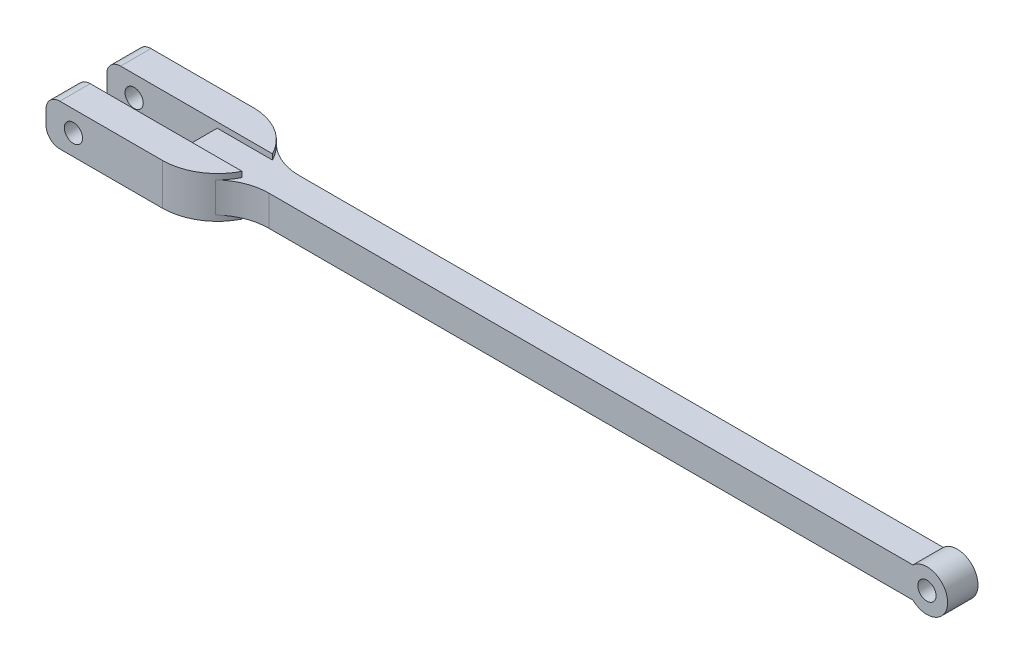
ISO-10303-21;
HEADER;
FILE_DESCRIPTION(('STEP AP214'),'2;1');
FILE_NAME('part.step','',(''),(''),'','','');
FILE_SCHEMA(('AUTOMOTIVE_DESIGN { 1 0 10303 214 1 1 1 1 }'));
ENDSEC;
DATA;
#1=APPLICATION_CONTEXT('core data for automotive mechanical design processes');
#2=APPLICATION_PROTOCOL_DEFINITION('international standard','automotive_design',2000,#1);
#3=PRODUCT_CONTEXT('',#1,'mechanical');
#4=PRODUCT('Part','Part','',(#3));
#5=PRODUCT_RELATED_PRODUCT_CATEGORY('part','',(#4));
#6=PRODUCT_DEFINITION_FORMATION('','',#4);
#7=PRODUCT_DEFINITION_CONTEXT('part definition',#1,'design');
#8=PRODUCT_DEFINITION('design','',#6,#7);
#9=PRODUCT_DEFINITION_SHAPE('','',#8);
#10=(LENGTH_UNIT() NAMED_UNIT(*) SI_UNIT(.MILLI.,.METRE.));
#11=(NAMED_UNIT(*) PLANE_ANGLE_UNIT() SI_UNIT($,.RADIAN.));
#12=(NAMED_UNIT(*) SI_UNIT($,.STERADIAN.) SOLID_ANGLE_UNIT());
#13=UNCERTAINTY_MEASURE_WITH_UNIT(LENGTH_MEASURE(1.E-05),#10,'distance_accuracy_value','');
#14=(GEOMETRIC_REPRESENTATION_CONTEXT(3) GLOBAL_UNCERTAINTY_ASSIGNED_CONTEXT((#13)) GLOBAL_UNIT_ASSIGNED_CONTEXT((#10,
#11,#12)) REPRESENTATION_CONTEXT('',''));
#15=CARTESIAN_POINT('',(0.,0.,0.));
#16=DIRECTION('',(0.,0.,1.));
#17=DIRECTION('',(1.,0.,0.));
#18=AXIS2_PLACEMENT_3D('',#15,#16,#17);
#19=CARTESIAN_POINT('',(-127.,-7.00615472610214,6.985));
#20=DIRECTION('',(0.,0.,1.));
#21=DIRECTION('',(1.,0.,0.));
#22=AXIS2_PLACEMENT_3D('',#19,#20,#21);
#23=PLANE('',#22);
#24=CARTESIAN_POINT('',(213.36,0.,6.985));
#25=DIRECTION('',(0.,0.,1.));
#26=DIRECTION('',(1.,0.,0.));
#27=AXIS2_PLACEMENT_3D('',#24,#25,#26);
#28=CIRCLE('',#27,4.191);
#29=CARTESIAN_POINT('',(217.551,0.,6.985));
#30=VERTEX_POINT('',#29);
#31=EDGE_CURVE('E1674',#30,#30,#28,.T.);
#32=ORIENTED_EDGE('',*,*,#31,.F.);
#33=EDGE_LOOP('',(#32));
#34=FACE_BOUND('',#33,.T.);
#35=DIRECTION('',(1.,0.,0.));
#36=VECTOR('',#35,1.);
#37=CARTESIAN_POINT('',(-127.,7.00615472610214,6.985));
#38=LINE('',#37,#36);
#39=CARTESIAN_POINT('',(-89.295353820586,7.00615472610214,6.985));
#40=VERTEX_POINT('',#39);
#41=CARTESIAN_POINT('',(206.907138545272,7.00615472610214,6.985));
#42=VERTEX_POINT('',#41);
#43=EDGE_CURVE('E1708',#40,#42,#38,.T.);
#44=ORIENTED_EDGE('',*,*,#43,.F.);
#45=DIRECTION('',(0.,1.,0.));
#46=VECTOR('',#45,1.);
#47=CARTESIAN_POINT('',(-89.295353820586,-7.00615472610213,6.985));
#48=LINE('',#47,#46);
#49=CARTESIAN_POINT('',(-89.295353820586,-7.00615472610214,6.985));
#50=VERTEX_POINT('',#49);
#51=EDGE_CURVE('E1732',#40,#50,#48,.F.);
#52=ORIENTED_EDGE('',*,*,#51,.T.);
#53=DIRECTION('',(1.,0.,0.));
#54=VECTOR('',#53,1.);
#55=CARTESIAN_POINT('',(-127.,-7.00615472610214,6.985));
#56=LINE('',#55,#54);
#57=CARTESIAN_POINT('',(206.907138545272,-7.00615472610214,6.985));
#58=VERTEX_POINT('',#57);
#59=EDGE_CURVE('E1702',#50,#58,#56,.T.);
#60=ORIENTED_EDGE('',*,*,#59,.T.);
#61=CARTESIAN_POINT('',(213.36,0.,6.985));
#62=DIRECTION('',(0.,0.,1.));
#63=DIRECTION('',(1.,0.,0.));
#64=AXIS2_PLACEMENT_3D('',#61,#62,#63);
#65=CIRCLE('',#64,9.525);
#66=EDGE_CURVE('E1681',#58,#42,#65,.T.);
#67=ORIENTED_EDGE('',*,*,#66,.T.);
#68=EDGE_LOOP('',(#44,#52,#60,#67));
#69=FACE_BOUND('',#68,.T.);
#70=ADVANCED_FACE('F1452',(#34,#69),#23,.T.);
#71=CARTESIAN_POINT('',(-127.,7.00615472610214,-6.985));
#72=DIRECTION('',(0.,1.,0.));
#73=DIRECTION('',(0.,0.,1.));
#74=AXIS2_PLACEMENT_3D('',#71,#72,#73);
#75=PLANE('',#74);
#76=CARTESIAN_POINT('',(-127.,7.00615472610214,6.985));
#77=VERTEX_POINT('',#76);
#78=CARTESIAN_POINT('',(-101.6,7.00615472610214,6.985));
#79=VERTEX_POINT('',#78);
#80=EDGE_CURVE('E1705',#77,#79,#38,.T.);
#81=ORIENTED_EDGE('',*,*,#80,.T.);
#82=CARTESIAN_POINT('',(-124.285401687268,7.00615472610214,-4.4490211063963));
#83=DIRECTION('',(0.,1.,0.));
#84=DIRECTION('',(0.,0.,1.));
#85=AXIS2_PLACEMENT_3D('',#82,#83,#84);
#86=CIRCLE('',#85,25.4040211063963);
#87=CARTESIAN_POINT('',(-106.788993033759,7.00615472610214,13.9694471416324));
#88=VERTEX_POINT('',#87);
#89=EDGE_CURVE('E1740',#88,#79,#86,.T.);
#90=ORIENTED_EDGE('',*,*,#89,.F.);
#91=CARTESIAN_POINT('',(-89.295353820586,7.00615472610214,32.385));
#92=DIRECTION('',(0.,1.,0.));
#93=DIRECTION('',(0.,0.,1.));
#94=AXIS2_PLACEMENT_3D('',#91,#92,#93);
#95=CIRCLE('',#94,25.4);
#96=EDGE_CURVE('E1750',#88,#40,#95,.F.);
#97=ORIENTED_EDGE('',*,*,#96,.T.);
#98=ORIENTED_EDGE('',*,*,#43,.T.);
#99=DIRECTION('',(0.,0.,-1.));
#100=VECTOR('',#99,1.);
#101=CARTESIAN_POINT('',(206.907138545272,7.00615472610214,33.9257683632075));
#102=LINE('',#101,#100);
#103=CARTESIAN_POINT('',(206.907138545272,7.00615472610214,-6.985));
#104=VERTEX_POINT('',#103);
#105=EDGE_CURVE('E1689',#42,#104,#102,.T.);
#106=ORIENTED_EDGE('',*,*,#105,.T.);
#107=DIRECTION('',(1.,0.,0.));
#108=VECTOR('',#107,1.);
#109=CARTESIAN_POINT('',(-127.,7.00615472610214,-6.985));
#110=LINE('',#109,#108);
#111=CARTESIAN_POINT('',(-89.295353820586,7.00615472610214,-6.985));
#112=VERTEX_POINT('',#111);
#113=EDGE_CURVE('E1706',#112,#104,#110,.T.);
#114=ORIENTED_EDGE('',*,*,#113,.F.);
#115=CARTESIAN_POINT('',(-89.295353820586,7.00615472610214,-32.385));
#116=DIRECTION('',(0.,1.,0.));
#117=DIRECTION('',(0.,0.,1.));
#118=AXIS2_PLACEMENT_3D('',#115,#116,#117);
#119=CIRCLE('',#118,25.4);
#120=CARTESIAN_POINT('',(-106.788993033759,7.00615472610214,-13.9694471416324));
#121=VERTEX_POINT('',#120);
#122=EDGE_CURVE('E1735',#112,#121,#119,.F.);
#123=ORIENTED_EDGE('',*,*,#122,.T.);
#124=CARTESIAN_POINT('',(-124.285401687268,7.00615472610214,4.4490211063963));
#125=DIRECTION('',(0.,1.,0.));
#126=DIRECTION('',(0.,0.,1.));
#127=AXIS2_PLACEMENT_3D('',#124,#125,#126);
#128=CIRCLE('',#127,25.4040211063963);
#129=CARTESIAN_POINT('',(-101.6,7.00615472610214,-6.985));
#130=VERTEX_POINT('',#129);
#131=EDGE_CURVE('E1720',#130,#121,#128,.T.);
#132=ORIENTED_EDGE('',*,*,#131,.F.);
#133=CARTESIAN_POINT('',(-127.,7.00615472610214,-6.985));
#134=VERTEX_POINT('',#133);
#135=EDGE_CURVE('E1709',#134,#130,#110,.T.);
#136=ORIENTED_EDGE('',*,*,#135,.F.);
#137=DIRECTION('',(0.,0.,1.));
#138=VECTOR('',#137,1.);
#139=CARTESIAN_POINT('',(-127.,7.00615472610214,-6.985));
#140=LINE('',#139,#138);
#141=EDGE_CURVE('E1699',#134,#77,#140,.T.);
#142=ORIENTED_EDGE('',*,*,#141,.T.);
#143=EDGE_LOOP('',(#81,#90,#97,#98,#106,#114,#123,#132,#136,#142));
#144=FACE_BOUND('',#143,.T.);
#145=ADVANCED_FACE('F1808',(#144),#75,.T.);
#146=CARTESIAN_POINT('',(-127.,-7.00615472610214,-6.985));
#147=DIRECTION('',(0.,-1.,0.));
#148=DIRECTION('',(0.,0.,-1.));
#149=AXIS2_PLACEMENT_3D('',#146,#147,#148);
#150=PLANE('',#149);
#151=DIRECTION('',(1.,0.,0.));
#152=VECTOR('',#151,1.);
#153=CARTESIAN_POINT('',(-127.,-7.00615472610214,-6.985));
#154=LINE('',#153,#152);
#155=CARTESIAN_POINT('',(-127.,-7.00615472610214,-6.985));
#156=VERTEX_POINT('',#155);
#157=CARTESIAN_POINT('',(-101.6,-7.00615472610213,-6.985));
#158=VERTEX_POINT('',#157);
#159=EDGE_CURVE('E1711',#156,#158,#154,.T.);
#160=ORIENTED_EDGE('',*,*,#159,.T.);
#161=CARTESIAN_POINT('',(-124.285401687268,-7.00615472610214,4.4490211063963));
#162=DIRECTION('',(0.,-1.,0.));
#163=DIRECTION('',(0.,0.,-1.));
#164=AXIS2_PLACEMENT_3D('',#161,#162,#163);
#165=CIRCLE('',#164,25.4040211063963);
#166=CARTESIAN_POINT('',(-106.788993033759,-7.00615472610214,-13.9694471416324));
#167=VERTEX_POINT('',#166);
#168=EDGE_CURVE('E1728',#167,#158,#165,.T.);
#169=ORIENTED_EDGE('',*,*,#168,.F.);
#170=CARTESIAN_POINT('',(-89.295353820586,-7.00615472610214,-32.385));
#171=DIRECTION('',(0.,-1.,0.));
#172=DIRECTION('',(0.,0.,-1.));
#173=AXIS2_PLACEMENT_3D('',#170,#171,#172);
#174=CIRCLE('',#173,25.4);
#175=CARTESIAN_POINT('',(-89.295353820586,-7.00615472610214,-6.985));
#176=VERTEX_POINT('',#175);
#177=EDGE_CURVE('E1727',#167,#176,#174,.F.);
#178=ORIENTED_EDGE('',*,*,#177,.T.);
#179=CARTESIAN_POINT('',(206.907138545272,-7.00615472610214,-6.985));
#180=VERTEX_POINT('',#179);
#181=EDGE_CURVE('E1713',#176,#180,#154,.T.);
#182=ORIENTED_EDGE('',*,*,#181,.T.);
#183=DIRECTION('',(0.,0.,-1.));
#184=VECTOR('',#183,1.);
#185=CARTESIAN_POINT('',(206.907138545272,-7.00615472610214,33.9257683632075));
#186=LINE('',#185,#184);
#187=EDGE_CURVE('E1703',#180,#58,#186,.F.);
#188=ORIENTED_EDGE('',*,*,#187,.T.);
#189=ORIENTED_EDGE('',*,*,#59,.F.);
#190=CARTESIAN_POINT('',(-89.295353820586,-7.00615472610214,32.385));
#191=DIRECTION('',(0.,-1.,0.));
#192=DIRECTION('',(0.,0.,-1.));
#193=AXIS2_PLACEMENT_3D('',#190,#191,#192);
#194=CIRCLE('',#193,25.4);
#195=CARTESIAN_POINT('',(-106.788993033759,-7.00615472610214,13.9694471416324));
#196=VERTEX_POINT('',#195);
#197=EDGE_CURVE('E1744',#50,#196,#194,.F.);
#198=ORIENTED_EDGE('',*,*,#197,.T.);
#199=CARTESIAN_POINT('',(-124.285401687268,-7.00615472610214,-4.4490211063963));
#200=DIRECTION('',(0.,-1.,0.));
#201=DIRECTION('',(0.,0.,-1.));
#202=AXIS2_PLACEMENT_3D('',#199,#200,#201);
#203=CIRCLE('',#202,25.4040211063963);
#204=CARTESIAN_POINT('',(-101.6,-7.00615472610214,6.985));
#205=VERTEX_POINT('',#204);
#206=EDGE_CURVE('E1745',#205,#196,#203,.T.);
#207=ORIENTED_EDGE('',*,*,#206,.F.);
#208=CARTESIAN_POINT('',(-127.,-7.00615472610214,6.985));
#209=VERTEX_POINT('',#208);
#210=EDGE_CURVE('E1715',#209,#205,#56,.T.);
#211=ORIENTED_EDGE('',*,*,#210,.F.);
#212=DIRECTION('',(0.,0.,-1.));
#213=VECTOR('',#212,1.);
#214=CARTESIAN_POINT('',(-127.,-7.00615472610214,-6.985));
#215=LINE('',#214,#213);
#216=EDGE_CURVE('E1692',#209,#156,#215,.T.);
#217=ORIENTED_EDGE('',*,*,#216,.T.);
#218=EDGE_LOOP('',(#160,#169,#178,#182,#188,#189,#198,#207,#211,#217));
#219=FACE_BOUND('',#218,.T.);
#220=ADVANCED_FACE('F1818',(#219),#150,.T.);
#221=CARTESIAN_POINT('',(-127.,-7.00615472610214,-6.985));
#222=DIRECTION('',(0.,0.,-1.));
#223=DIRECTION('',(-1.,0.,0.));
#224=AXIS2_PLACEMENT_3D('',#221,#222,#223);
#225=PLANE('',#224);
#226=ORIENTED_EDGE('',*,*,#181,.F.);
#227=DIRECTION('',(0.,-1.,0.));
#228=VECTOR('',#227,1.);
#229=CARTESIAN_POINT('',(-89.295353820586,-7.00615472610214,-6.985));
#230=LINE('',#229,#228);
#231=EDGE_CURVE('E1726',#176,#112,#230,.F.);
#232=ORIENTED_EDGE('',*,*,#231,.T.);
#233=ORIENTED_EDGE('',*,*,#113,.T.);
#234=CARTESIAN_POINT('',(213.36,0.,-6.985));
#235=DIRECTION('',(0.,0.,-1.));
#236=DIRECTION('',(-1.,0.,0.));
#237=AXIS2_PLACEMENT_3D('',#234,#235,#236);
#238=CIRCLE('',#237,9.525);
#239=EDGE_CURVE('E1682',#180,#104,#238,.F.);
#240=ORIENTED_EDGE('',*,*,#239,.F.);
#241=EDGE_LOOP('',(#226,#232,#233,#240));
#242=FACE_BOUND('',#241,.T.);
#243=CARTESIAN_POINT('',(213.36,0.,-6.985));
#244=DIRECTION('',(0.,0.,1.));
#245=DIRECTION('',(1.,0.,0.));
#246=AXIS2_PLACEMENT_3D('',#243,#244,#245);
#247=CIRCLE('',#246,4.191);
#248=CARTESIAN_POINT('',(217.551,0.,-6.985));
#249=VERTEX_POINT('',#248);
#250=EDGE_CURVE('E1677',#249,#249,#247,.T.);
#251=ORIENTED_EDGE('',*,*,#250,.T.);
#252=EDGE_LOOP('',(#251));
#253=FACE_BOUND('',#252,.T.);
#254=ADVANCED_FACE('F1937',(#242,#253),#225,.T.);
#255=CARTESIAN_POINT('',(-127.,0.,0.));
#256=DIRECTION('',(1.,0.,0.));
#257=DIRECTION('',(0.,0.,-1.));
#258=AXIS2_PLACEMENT_3D('',#255,#256,#257);
#259=PLANE('',#258);
#260=DIRECTION('',(0.,-1.,0.));
#261=VECTOR('',#260,1.);
#262=CARTESIAN_POINT('',(-127.,-7.00615472610214,6.985));
#263=LINE('',#262,#261);
#264=EDGE_CURVE('E1686',#77,#209,#263,.T.);
#265=ORIENTED_EDGE('',*,*,#264,.F.);
#266=ORIENTED_EDGE('',*,*,#141,.F.);
#267=DIRECTION('',(0.,1.,0.));
#268=VECTOR('',#267,1.);
#269=CARTESIAN_POINT('',(-127.,-7.00615472610214,-6.985));
#270=LINE('',#269,#268);
#271=EDGE_CURVE('E1695',#156,#134,#270,.T.);
#272=ORIENTED_EDGE('',*,*,#271,.F.);
#273=ORIENTED_EDGE('',*,*,#216,.F.);
#274=EDGE_LOOP('',(#265,#266,#272,#273));
#275=FACE_BOUND('',#274,.T.);
#276=ADVANCED_FACE('F1931',(#275),#259,.F.);
#277=CARTESIAN_POINT('',(213.36,0.,33.9257683632075));
#278=DIRECTION('',(0.,0.,-1.));
#279=DIRECTION('',(-1.,0.,0.));
#280=AXIS2_PLACEMENT_3D('',#277,#278,#279);
#281=CYLINDRICAL_SURFACE('',#280,9.525);
#282=ORIENTED_EDGE('',*,*,#105,.F.);
#283=ORIENTED_EDGE('',*,*,#66,.F.);
#284=ORIENTED_EDGE('',*,*,#187,.F.);
#285=ORIENTED_EDGE('',*,*,#239,.T.);
#286=EDGE_LOOP('',(#282,#283,#284,#285));
#287=FACE_BOUND('',#286,.T.);
#288=ADVANCED_FACE('F1866',(#287),#281,.T.);
#289=CARTESIAN_POINT('',(213.36,0.,-6.985));
#290=DIRECTION('',(0.,0.,1.));
#291=DIRECTION('',(1.,0.,0.));
#292=AXIS2_PLACEMENT_3D('',#289,#290,#291);
#293=CYLINDRICAL_SURFACE('',#292,4.191);
#294=CARTESIAN_POINT('',(217.551,0.,-6.985));
#295=CARTESIAN_POINT('',(217.551,0.,-6.83947916666667));
#296=CARTESIAN_POINT('',(217.551,0.,-6.69395833333334));
#297=CARTESIAN_POINT('',(217.551,0.,-6.40291666666667));
#298=CARTESIAN_POINT('',(217.551,0.,-6.25739583333334));
#299=CARTESIAN_POINT('',(217.551,0.,-5.96635416666667));
#300=CARTESIAN_POINT('',(217.551,0.,-5.82083333333333));
#301=CARTESIAN_POINT('',(217.551,0.,-5.52979166666667));
#302=CARTESIAN_POINT('',(217.551,0.,-5.38427083333334));
#303=CARTESIAN_POINT('',(217.551,0.,-5.09322916666667));
#304=CARTESIAN_POINT('',(217.551,0.,-4.94770833333334));
#305=CARTESIAN_POINT('',(217.551,0.,-4.65666666666667));
#306=CARTESIAN_POINT('',(217.551,0.,-4.51114583333333));
#307=CARTESIAN_POINT('',(217.551,0.,-4.22010416666667));
#308=CARTESIAN_POINT('',(217.551,0.,-4.07458333333334));
#309=CARTESIAN_POINT('',(217.551,0.,-3.78354166666667));
#310=CARTESIAN_POINT('',(217.551,0.,-3.63802083333334));
#311=CARTESIAN_POINT('',(217.551,0.,-3.34697916666667));
#312=CARTESIAN_POINT('',(217.551,0.,-3.20145833333333));
#313=CARTESIAN_POINT('',(217.551,0.,-2.91041666666667));
#314=CARTESIAN_POINT('',(217.551,0.,-2.76489583333333));
#315=CARTESIAN_POINT('',(217.551,0.,-2.47385416666667));
#316=CARTESIAN_POINT('',(217.551,0.,-2.32833333333333));
#317=CARTESIAN_POINT('',(217.551,0.,-2.03729166666667));
#318=CARTESIAN_POINT('',(217.551,0.,-1.89177083333333));
#319=CARTESIAN_POINT('',(217.551,0.,-1.60072916666667));
#320=CARTESIAN_POINT('',(217.551,0.,-1.45520833333333));
#321=CARTESIAN_POINT('',(217.551,0.,-1.16416666666667));
#322=CARTESIAN_POINT('',(217.551,0.,-1.01864583333333));
#323=CARTESIAN_POINT('',(217.551,0.,-0.727604166666668));
#324=CARTESIAN_POINT('',(217.551,0.,-0.582083333333335));
#325=CARTESIAN_POINT('',(217.551,0.,-0.291041666666668));
#326=CARTESIAN_POINT('',(217.551,0.,-0.145520833333334));
#327=CARTESIAN_POINT('',(217.551,0.,0.145520833333333));
#328=CARTESIAN_POINT('',(217.551,0.,0.291041666666666));
#329=CARTESIAN_POINT('',(217.551,0.,0.582083333333333));
#330=CARTESIAN_POINT('',(217.551,0.,0.727604166666666));
#331=CARTESIAN_POINT('',(217.551,0.,1.01864583333333));
#332=CARTESIAN_POINT('',(217.551,0.,1.16416666666667));
#333=CARTESIAN_POINT('',(217.551,0.,1.45520833333333));
#334=CARTESIAN_POINT('',(217.551,0.,1.60072916666667));
#335=CARTESIAN_POINT('',(217.551,0.,1.89177083333333));
#336=CARTESIAN_POINT('',(217.551,0.,2.03729166666667));
#337=CARTESIAN_POINT('',(217.551,0.,2.32833333333333));
#338=CARTESIAN_POINT('',(217.551,0.,2.47385416666667));
#339=CARTESIAN_POINT('',(217.551,0.,2.76489583333333));
#340=CARTESIAN_POINT('',(217.551,0.,2.91041666666667));
#341=CARTESIAN_POINT('',(217.551,0.,3.20145833333333));
#342=CARTESIAN_POINT('',(217.551,0.,3.34697916666667));
#343=CARTESIAN_POINT('',(217.551,0.,3.63802083333333));
#344=CARTESIAN_POINT('',(217.551,0.,3.78354166666667));
#345=CARTESIAN_POINT('',(217.551,0.,4.07458333333333));
#346=CARTESIAN_POINT('',(217.551,0.,4.22010416666667));
#347=CARTESIAN_POINT('',(217.551,0.,4.51114583333333));
#348=CARTESIAN_POINT('',(217.551,0.,4.65666666666667));
#349=CARTESIAN_POINT('',(217.551,0.,4.94770833333333));
#350=CARTESIAN_POINT('',(217.551,0.,5.09322916666667));
#351=CARTESIAN_POINT('',(217.551,0.,5.38427083333333));
#352=CARTESIAN_POINT('',(217.551,0.,5.52979166666667));
#353=CARTESIAN_POINT('',(217.551,0.,5.82083333333333));
#354=CARTESIAN_POINT('',(217.551,0.,5.96635416666667));
#355=CARTESIAN_POINT('',(217.551,0.,6.25739583333333));
#356=CARTESIAN_POINT('',(217.551,0.,6.40291666666667));
#357=CARTESIAN_POINT('',(217.551,0.,6.69395833333333));
#358=CARTESIAN_POINT('',(217.551,0.,6.83947916666667));
#359=CARTESIAN_POINT('',(217.551,0.,6.985));
#360=B_SPLINE_CURVE_WITH_KNOTS('',3,(#294,#295,#296,#297,#298,#299,#300,#301,#302,#303,#304,
#305,#306,#307,#308,#309,#310,#311,#312,#313,#314,#315,#316,#317,#318,#319,#320,#321,#322,#323,
#324,#325,#326,#327,#328,#329,#330,#331,#332,#333,#334,#335,#336,#337,#338,#339,#340,#341,#342,
#343,#344,#345,#346,#347,#348,#349,#350,#351,#352,#353,#354,#355,#356,#357,#358,#359),
.UNSPECIFIED.,.F.,.F.,(4,2,2,2,2,2,2,2,2,2,2,2,2,2,2,2,2,2,2,2,2,2,2,2,2,2,2,2,2,2,2,2,4),(0.,
0.436562499999999,0.873125,1.3096875,1.74625,2.1828125,2.619375,3.0559375,3.4925,3.9290625,
4.365625,4.8021875,5.23875,5.6753125,6.111875,6.5484375,6.985,7.4215625,7.858125,8.2946875,
8.73125,9.1678125,9.604375,10.0409375,10.4775,10.9140625,11.350625,11.7871875,12.22375,
12.6603125,13.096875,13.5334375,13.97),.UNSPECIFIED.);
#361=EDGE_CURVE('BSEAM1861',#249,#30,#360,.T.);
#362=ORIENTED_EDGE('',*,*,#250,.F.);
#363=ORIENTED_EDGE('',*,*,#31,.T.);
#364=ORIENTED_EDGE('',*,*,#361,.T.);
#365=ORIENTED_EDGE('',*,*,#361,.F.);
#366=EDGE_LOOP('',(#362,#364,#363,#365));
#367=FACE_BOUND('',#366,.T.);
#368=ADVANCED_FACE('F1861',(#367),#293,.F.);
#369=CARTESIAN_POINT('',(-127.,9.525,-6.985));
#370=DIRECTION('',(0.,0.,-1.));
#371=DIRECTION('',(-1.,0.,0.));
#372=AXIS2_PLACEMENT_3D('',#369,#370,#371);
#373=PLANE('',#372);
#374=CARTESIAN_POINT('',(-165.198377534268,0.,-6.985));
#375=DIRECTION('',(0.,0.,-1.));
#376=DIRECTION('',(-1.,0.,0.));
#377=AXIS2_PLACEMENT_3D('',#374,#375,#376);
#378=CIRCLE('',#377,4.191);
#379=CARTESIAN_POINT('',(-169.389377534268,0.,-6.985));
#380=VERTEX_POINT('',#379);
#381=EDGE_CURVE('E1635',#380,#380,#378,.T.);
#382=ORIENTED_EDGE('',*,*,#381,.T.);
#383=EDGE_LOOP('',(#382));
#384=FACE_BOUND('',#383,.T.);
#385=DIRECTION('',(0.,-1.,0.));
#386=VECTOR('',#385,1.);
#387=CARTESIAN_POINT('',(-177.8,9.525,-6.98499999999999));
#388=LINE('',#387,#386);
#389=CARTESIAN_POINT('',(-177.8,3.175,-6.98499999999999));
#390=VERTEX_POINT('',#389);
#391=CARTESIAN_POINT('',(-177.8,-3.175,-6.98499999999999));
#392=VERTEX_POINT('',#391);
#393=EDGE_CURVE('E1661',#390,#392,#388,.T.);
#394=ORIENTED_EDGE('',*,*,#393,.T.);
#395=CARTESIAN_POINT('',(-171.45,-3.175,-6.985));
#396=DIRECTION('',(0.,0.,-1.));
#397=DIRECTION('',(-1.,0.,0.));
#398=AXIS2_PLACEMENT_3D('',#395,#396,#397);
#399=CIRCLE('',#398,6.35);
#400=CARTESIAN_POINT('',(-171.45,-9.525,-6.985));
#401=VERTEX_POINT('',#400);
#402=EDGE_CURVE('E1768',#392,#401,#399,.F.);
#403=ORIENTED_EDGE('',*,*,#402,.T.);
#404=DIRECTION('',(1.,0.,0.));
#405=VECTOR('',#404,1.);
#406=CARTESIAN_POINT('',(-127.,-9.525,-6.985));
#407=LINE('',#406,#405);
#408=CARTESIAN_POINT('',(-101.6,-9.525,-6.985));
#409=VERTEX_POINT('',#408);
#410=EDGE_CURVE('E1650',#401,#409,#407,.T.);
#411=ORIENTED_EDGE('',*,*,#410,.T.);
#412=DIRECTION('',(0.,-1.,0.));
#413=VECTOR('',#412,1.);
#414=CARTESIAN_POINT('',(-101.6,9.525,-6.985));
#415=LINE('',#414,#413);
#416=EDGE_CURVE('E1671',#158,#409,#415,.T.);
#417=ORIENTED_EDGE('',*,*,#416,.F.);
#418=ORIENTED_EDGE('',*,*,#159,.F.);
#419=ORIENTED_EDGE('',*,*,#271,.T.);
#420=ORIENTED_EDGE('',*,*,#135,.T.);
#421=CARTESIAN_POINT('',(-101.6,9.525,-6.985));
#422=VERTEX_POINT('',#421);
#423=EDGE_CURVE('E1675',#422,#130,#415,.T.);
#424=ORIENTED_EDGE('',*,*,#423,.F.);
#425=DIRECTION('',(1.,0.,0.));
#426=VECTOR('',#425,1.);
#427=CARTESIAN_POINT('',(-127.,9.525,-6.985));
#428=LINE('',#427,#426);
#429=CARTESIAN_POINT('',(-171.45,9.525,-6.985));
#430=VERTEX_POINT('',#429);
#431=EDGE_CURVE('E1657',#430,#422,#428,.T.);
#432=ORIENTED_EDGE('',*,*,#431,.F.);
#433=CARTESIAN_POINT('',(-171.45,3.175,-6.98499999999999));
#434=DIRECTION('',(0.,0.,-1.));
#435=DIRECTION('',(-1.,0.,0.));
#436=AXIS2_PLACEMENT_3D('',#433,#434,#435);
#437=CIRCLE('',#436,6.35);
#438=EDGE_CURVE('E1766',#430,#390,#437,.F.);
#439=ORIENTED_EDGE('',*,*,#438,.T.);
#440=EDGE_LOOP('',(#394,#403,#411,#417,#418,#419,#420,#424,#432,#439));
#441=FACE_BOUND('',#440,.T.);
#442=ADVANCED_FACE('F1783',(#384,#441),#373,.F.);
#443=CARTESIAN_POINT('',(-124.285401687268,9.525,4.4490211063963));
#444=DIRECTION('',(0.,-1.,0.));
#445=DIRECTION('',(0.,0.,-1.));
#446=AXIS2_PLACEMENT_3D('',#443,#444,#445);
#447=CYLINDRICAL_SURFACE('',#446,25.4040211063963);
#448=DIRECTION('',(0.,-1.,0.));
#449=VECTOR('',#448,1.);
#450=CARTESIAN_POINT('',(-106.788993033759,9.525,-13.9694471416324));
#451=LINE('',#450,#449);
#452=EDGE_CURVE('E1721',#121,#167,#451,.T.);
#453=ORIENTED_EDGE('',*,*,#452,.T.);
#454=ORIENTED_EDGE('',*,*,#168,.T.);
#455=ORIENTED_EDGE('',*,*,#416,.T.);
#456=CARTESIAN_POINT('',(-124.285401687268,-9.525,4.4490211063963));
#457=DIRECTION('',(0.,1.,0.));
#458=DIRECTION('',(0.,0.,-1.));
#459=AXIS2_PLACEMENT_3D('',#456,#457,#458);
#460=CIRCLE('',#459,25.4040211063963);
#461=CARTESIAN_POINT('',(-124.285401687268,-9.525,-20.955));
#462=VERTEX_POINT('',#461);
#463=EDGE_CURVE('E1652',#409,#462,#460,.T.);
#464=ORIENTED_EDGE('',*,*,#463,.T.);
#465=DIRECTION('',(0.,-1.,0.));
#466=VECTOR('',#465,1.);
#467=CARTESIAN_POINT('',(-124.285401687268,9.525,-20.955));
#468=LINE('',#467,#466);
#469=CARTESIAN_POINT('',(-124.285401687268,9.525,-20.955));
#470=VERTEX_POINT('',#469);
#471=EDGE_CURVE('E1667',#470,#462,#468,.T.);
#472=ORIENTED_EDGE('',*,*,#471,.F.);
#473=CARTESIAN_POINT('',(-124.285401687268,9.525,4.4490211063963));
#474=DIRECTION('',(0.,1.,0.));
#475=DIRECTION('',(0.,0.,-1.));
#476=AXIS2_PLACEMENT_3D('',#473,#474,#475);
#477=CIRCLE('',#476,25.4040211063963);
#478=EDGE_CURVE('E1660',#422,#470,#477,.T.);
#479=ORIENTED_EDGE('',*,*,#478,.F.);
#480=ORIENTED_EDGE('',*,*,#423,.T.);
#481=ORIENTED_EDGE('',*,*,#131,.T.);
#482=EDGE_LOOP('',(#453,#454,#455,#464,#472,#479,#480,#481));
#483=FACE_BOUND('',#482,.T.);
#484=ADVANCED_FACE('F1787',(#483),#447,.T.);
#485=CARTESIAN_POINT('',(-177.8,9.525,-20.955));
#486=DIRECTION('',(0.,0.,1.));
#487=DIRECTION('',(1.,0.,0.));
#488=AXIS2_PLACEMENT_3D('',#485,#486,#487);
#489=PLANE('',#488);
#490=CARTESIAN_POINT('',(-165.198377534268,0.,-20.955));
#491=DIRECTION('',(0.,0.,1.));
#492=DIRECTION('',(1.,0.,0.));
#493=AXIS2_PLACEMENT_3D('',#490,#491,#492);
#494=CIRCLE('',#493,4.191);
#495=CARTESIAN_POINT('',(-161.007377534268,0.,-20.955));
#496=VERTEX_POINT('',#495);
#497=EDGE_CURVE('E1873',#496,#496,#494,.T.);
#498=ORIENTED_EDGE('',*,*,#497,.T.);
#499=EDGE_LOOP('',(#498));
#500=FACE_BOUND('',#499,.T.);
#501=DIRECTION('',(-1.,0.,0.));
#502=VECTOR('',#501,1.);
#503=CARTESIAN_POINT('',(-177.8,-9.525,-20.955));
#504=LINE('',#503,#502);
#505=CARTESIAN_POINT('',(-171.45,-9.525,-20.955));
#506=VERTEX_POINT('',#505);
#507=EDGE_CURVE('E1655',#462,#506,#504,.T.);
#508=ORIENTED_EDGE('',*,*,#507,.T.);
#509=CARTESIAN_POINT('',(-171.45,-3.175,-20.955));
#510=DIRECTION('',(0.,0.,1.));
#511=DIRECTION('',(1.,0.,0.));
#512=AXIS2_PLACEMENT_3D('',#509,#510,#511);
#513=CIRCLE('',#512,6.35);
#514=CARTESIAN_POINT('',(-177.8,-3.175,-20.955));
#515=VERTEX_POINT('',#514);
#516=EDGE_CURVE('E1775',#506,#515,#513,.F.);
#517=ORIENTED_EDGE('',*,*,#516,.T.);
#518=DIRECTION('',(0.,-1.,0.));
#519=VECTOR('',#518,1.);
#520=CARTESIAN_POINT('',(-177.8,9.525,-20.955));
#521=LINE('',#520,#519);
#522=CARTESIAN_POINT('',(-177.8,3.175,-20.955));
#523=VERTEX_POINT('',#522);
#524=EDGE_CURVE('E1666',#523,#515,#521,.T.);
#525=ORIENTED_EDGE('',*,*,#524,.F.);
#526=CARTESIAN_POINT('',(-171.45,3.175,-20.955));
#527=DIRECTION('',(0.,0.,1.));
#528=DIRECTION('',(1.,0.,0.));
#529=AXIS2_PLACEMENT_3D('',#526,#527,#528);
#530=CIRCLE('',#529,6.35);
#531=CARTESIAN_POINT('',(-171.45,9.525,-20.955));
#532=VERTEX_POINT('',#531);
#533=EDGE_CURVE('E1470',#523,#532,#530,.F.);
#534=ORIENTED_EDGE('',*,*,#533,.T.);
#535=DIRECTION('',(-1.,0.,0.));
#536=VECTOR('',#535,1.);
#537=CARTESIAN_POINT('',(-177.8,9.525,-20.955));
#538=LINE('',#537,#536);
#539=EDGE_CURVE('E1663',#470,#532,#538,.T.);
#540=ORIENTED_EDGE('',*,*,#539,.F.);
#541=ORIENTED_EDGE('',*,*,#471,.T.);
#542=EDGE_LOOP('',(#508,#517,#525,#534,#540,#541));
#543=FACE_BOUND('',#542,.T.);
#544=ADVANCED_FACE('F1795',(#500,#543),#489,.F.);
#545=CARTESIAN_POINT('',(-177.8,9.525,-6.98499999999999));
#546=DIRECTION('',(1.,0.,0.));
#547=DIRECTION('',(0.,0.,-1.));
#548=AXIS2_PLACEMENT_3D('',#545,#546,#547);
#549=PLANE('',#548);
#550=ORIENTED_EDGE('',*,*,#524,.T.);
#551=DIRECTION('',(0.,0.,1.));
#552=VECTOR('',#551,1.);
#553=CARTESIAN_POINT('',(-177.8,-3.175,-6.98499999999999));
#554=LINE('',#553,#552);
#555=EDGE_CURVE('E1765',#515,#392,#554,.T.);
#556=ORIENTED_EDGE('',*,*,#555,.T.);
#557=ORIENTED_EDGE('',*,*,#393,.F.);
#558=DIRECTION('',(0.,0.,1.));
#559=VECTOR('',#558,1.);
#560=CARTESIAN_POINT('',(-177.8,3.175,-6.98499999999999));
#561=LINE('',#560,#559);
#562=EDGE_CURVE('E1764',#390,#523,#561,.F.);
#563=ORIENTED_EDGE('',*,*,#562,.T.);
#564=EDGE_LOOP('',(#550,#556,#557,#563));
#565=FACE_BOUND('',#564,.T.);
#566=ADVANCED_FACE('F1792',(#565),#549,.F.);
#567=CARTESIAN_POINT('',(-124.285401687268,9.525,4.4490211063963));
#568=DIRECTION('',(0.,-1.,0.));
#569=DIRECTION('',(0.,0.,-1.));
#570=AXIS2_PLACEMENT_3D('',#567,#568,#569);
#571=PLANE('',#570);
#572=ORIENTED_EDGE('',*,*,#539,.T.);
#573=DIRECTION('',(0.,0.,1.));
#574=VECTOR('',#573,1.);
#575=CARTESIAN_POINT('',(-171.45,9.525,4.4490211063963));
#576=LINE('',#575,#574);
#577=EDGE_CURVE('E1460',#532,#430,#576,.T.);
#578=ORIENTED_EDGE('',*,*,#577,.T.);
#579=ORIENTED_EDGE('',*,*,#431,.T.);
#580=ORIENTED_EDGE('',*,*,#478,.T.);
#581=EDGE_LOOP('',(#572,#578,#579,#580));
#582=FACE_BOUND('',#581,.T.);
#583=ADVANCED_FACE('F1778',(#582),#571,.F.);
#584=CARTESIAN_POINT('',(-124.285401687268,-9.525,4.4490211063963));
#585=DIRECTION('',(0.,-1.,0.));
#586=DIRECTION('',(0.,0.,-1.));
#587=AXIS2_PLACEMENT_3D('',#584,#585,#586);
#588=PLANE('',#587);
#589=ORIENTED_EDGE('',*,*,#410,.F.);
#590=DIRECTION('',(0.,0.,1.));
#591=VECTOR('',#590,1.);
#592=CARTESIAN_POINT('',(-171.45,-9.525,-20.955));
#593=LINE('',#592,#591);
#594=EDGE_CURVE('E1474',#401,#506,#593,.F.);
#595=ORIENTED_EDGE('',*,*,#594,.T.);
#596=ORIENTED_EDGE('',*,*,#507,.F.);
#597=ORIENTED_EDGE('',*,*,#463,.F.);
#598=EDGE_LOOP('',(#589,#595,#596,#597));
#599=FACE_BOUND('',#598,.T.);
#600=ADVANCED_FACE('F1829',(#599),#588,.T.);
#601=CARTESIAN_POINT('',(-89.295353820586,9.525,-32.385));
#602=DIRECTION('',(0.,-1.,0.));
#603=DIRECTION('',(0.,0.,-1.));
#604=AXIS2_PLACEMENT_3D('',#601,#602,#603);
#605=CYLINDRICAL_SURFACE('',#604,25.4);
#606=ORIENTED_EDGE('',*,*,#122,.F.);
#607=ORIENTED_EDGE('',*,*,#231,.F.);
#608=ORIENTED_EDGE('',*,*,#177,.F.);
#609=ORIENTED_EDGE('',*,*,#452,.F.);
#610=EDGE_LOOP('',(#606,#607,#608,#609));
#611=FACE_BOUND('',#610,.T.);
#612=ADVANCED_FACE('F1823',(#611),#605,.F.);
#613=CARTESIAN_POINT('',(-127.,9.525,6.985));
#614=DIRECTION('',(0.,0.,-1.));
#615=DIRECTION('',(-1.,0.,0.));
#616=AXIS2_PLACEMENT_3D('',#613,#614,#615);
#617=PLANE('',#616);
#618=CARTESIAN_POINT('',(-165.198377534268,0.,6.985));
#619=DIRECTION('',(0.,0.,-1.));
#620=DIRECTION('',(-1.,0.,0.));
#621=AXIS2_PLACEMENT_3D('',#618,#619,#620);
#622=CIRCLE('',#621,4.191);
#623=CARTESIAN_POINT('',(-169.389377534268,0.,6.985));
#624=VERTEX_POINT('',#623);
#625=EDGE_CURVE('E1875',#624,#624,#622,.T.);
#626=ORIENTED_EDGE('',*,*,#625,.F.);
#627=EDGE_LOOP('',(#626));
#628=FACE_BOUND('',#627,.T.);
#629=DIRECTION('',(1.,0.,0.));
#630=VECTOR('',#629,1.);
#631=CARTESIAN_POINT('',(-127.,-9.525,6.985));
#632=LINE('',#631,#630);
#633=CARTESIAN_POINT('',(-171.45,-9.525,6.985));
#634=VERTEX_POINT('',#633);
#635=CARTESIAN_POINT('',(-101.6,-9.525,6.985));
#636=VERTEX_POINT('',#635);
#637=EDGE_CURVE('E1626',#634,#636,#632,.T.);
#638=ORIENTED_EDGE('',*,*,#637,.F.);
#639=CARTESIAN_POINT('',(-171.45,-3.175,6.98499999999999));
#640=DIRECTION('',(0.,0.,-1.));
#641=DIRECTION('',(-1.,0.,0.));
#642=AXIS2_PLACEMENT_3D('',#639,#640,#641);
#643=CIRCLE('',#642,6.35);
#644=CARTESIAN_POINT('',(-177.8,-3.175,6.98499999999999));
#645=VERTEX_POINT('',#644);
#646=EDGE_CURVE('E1752',#634,#645,#643,.T.);
#647=ORIENTED_EDGE('',*,*,#646,.T.);
#648=DIRECTION('',(0.,-1.,0.));
#649=VECTOR('',#648,1.);
#650=CARTESIAN_POINT('',(-177.8,9.525,6.98499999999999));
#651=LINE('',#650,#649);
#652=CARTESIAN_POINT('',(-177.8,3.175,6.98499999999999));
#653=VERTEX_POINT('',#652);
#654=EDGE_CURVE('E1647',#653,#645,#651,.T.);
#655=ORIENTED_EDGE('',*,*,#654,.F.);
#656=CARTESIAN_POINT('',(-171.45,3.175,6.985));
#657=DIRECTION('',(0.,0.,-1.));
#658=DIRECTION('',(-1.,0.,0.));
#659=AXIS2_PLACEMENT_3D('',#656,#657,#658);
#660=CIRCLE('',#659,6.35);
#661=CARTESIAN_POINT('',(-171.45,9.525,6.985));
#662=VERTEX_POINT('',#661);
#663=EDGE_CURVE('E1753',#653,#662,#660,.T.);
#664=ORIENTED_EDGE('',*,*,#663,.T.);
#665=DIRECTION('',(1.,0.,0.));
#666=VECTOR('',#665,1.);
#667=CARTESIAN_POINT('',(-127.,9.525,6.985));
#668=LINE('',#667,#666);
#669=CARTESIAN_POINT('',(-101.6,9.525,6.985));
#670=VERTEX_POINT('',#669);
#671=EDGE_CURVE('E1629',#662,#670,#668,.T.);
#672=ORIENTED_EDGE('',*,*,#671,.T.);
#673=DIRECTION('',(0.,-1.,0.));
#674=VECTOR('',#673,1.);
#675=CARTESIAN_POINT('',(-101.6,9.525,6.985));
#676=LINE('',#675,#674);
#677=EDGE_CURVE('E1620',#670,#79,#676,.T.);
#678=ORIENTED_EDGE('',*,*,#677,.T.);
#679=ORIENTED_EDGE('',*,*,#80,.F.);
#680=ORIENTED_EDGE('',*,*,#264,.T.);
#681=ORIENTED_EDGE('',*,*,#210,.T.);
#682=EDGE_CURVE('E1642',#205,#636,#676,.T.);
#683=ORIENTED_EDGE('',*,*,#682,.T.);
#684=EDGE_LOOP('',(#638,#647,#655,#664,#672,#678,#679,#680,#681,#683));
#685=FACE_BOUND('',#684,.T.);
#686=ADVANCED_FACE('F1827',(#628,#685),#617,.T.);
#687=CARTESIAN_POINT('',(-177.8,9.525,6.98499999999999));
#688=DIRECTION('',(-1.,0.,0.));
#689=DIRECTION('',(0.,0.,1.));
#690=AXIS2_PLACEMENT_3D('',#687,#688,#689);
#691=PLANE('',#690);
#692=ORIENTED_EDGE('',*,*,#654,.T.);
#693=DIRECTION('',(0.,0.,-1.));
#694=VECTOR('',#693,1.);
#695=CARTESIAN_POINT('',(-177.8,-3.175,6.98499999999999));
#696=LINE('',#695,#694);
#697=CARTESIAN_POINT('',(-177.8,-3.175,20.955));
#698=VERTEX_POINT('',#697);
#699=EDGE_CURVE('E1759',#645,#698,#696,.F.);
#700=ORIENTED_EDGE('',*,*,#699,.T.);
#701=DIRECTION('',(0.,-1.,0.));
#702=VECTOR('',#701,1.);
#703=CARTESIAN_POINT('',(-177.8,9.525,20.955));
#704=LINE('',#703,#702);
#705=CARTESIAN_POINT('',(-177.8,3.175,20.955));
#706=VERTEX_POINT('',#705);
#707=EDGE_CURVE('E1617',#706,#698,#704,.T.);
#708=ORIENTED_EDGE('',*,*,#707,.F.);
#709=DIRECTION('',(0.,0.,-1.));
#710=VECTOR('',#709,1.);
#711=CARTESIAN_POINT('',(-177.8,3.175,6.98499999999999));
#712=LINE('',#711,#710);
#713=EDGE_CURVE('E1751',#706,#653,#712,.T.);
#714=ORIENTED_EDGE('',*,*,#713,.T.);
#715=EDGE_LOOP('',(#692,#700,#708,#714));
#716=FACE_BOUND('',#715,.T.);
#717=ADVANCED_FACE('F1885',(#716),#691,.T.);
#718=CARTESIAN_POINT('',(-177.8,9.525,20.955));
#719=DIRECTION('',(0.,0.,1.));
#720=DIRECTION('',(1.,0.,0.));
#721=AXIS2_PLACEMENT_3D('',#718,#719,#720);
#722=PLANE('',#721);
#723=CARTESIAN_POINT('',(-165.198377534268,0.,20.955));
#724=DIRECTION('',(0.,0.,1.));
#725=DIRECTION('',(1.,0.,0.));
#726=AXIS2_PLACEMENT_3D('',#723,#724,#725);
#727=CIRCLE('',#726,4.191);
#728=CARTESIAN_POINT('',(-161.007377534268,0.,20.955));
#729=VERTEX_POINT('',#728);
#730=EDGE_CURVE('E1879',#729,#729,#727,.T.);
#731=ORIENTED_EDGE('',*,*,#730,.F.);
#732=EDGE_LOOP('',(#731));
#733=FACE_BOUND('',#732,.T.);
#734=ORIENTED_EDGE('',*,*,#707,.T.);
#735=CARTESIAN_POINT('',(-171.45,-3.175,20.955));
#736=DIRECTION('',(0.,0.,1.));
#737=DIRECTION('',(1.,0.,0.));
#738=AXIS2_PLACEMENT_3D('',#735,#736,#737);
#739=CIRCLE('',#738,6.35);
#740=CARTESIAN_POINT('',(-171.45,-9.525,20.955));
#741=VERTEX_POINT('',#740);
#742=EDGE_CURVE('E1634',#698,#741,#739,.T.);
#743=ORIENTED_EDGE('',*,*,#742,.T.);
#744=DIRECTION('',(-1.,0.,0.));
#745=VECTOR('',#744,1.);
#746=CARTESIAN_POINT('',(-177.8,-9.525,20.955));
#747=LINE('',#746,#745);
#748=CARTESIAN_POINT('',(-124.285401687268,-9.525,20.955));
#749=VERTEX_POINT('',#748);
#750=EDGE_CURVE('E1622',#749,#741,#747,.T.);
#751=ORIENTED_EDGE('',*,*,#750,.F.);
#752=DIRECTION('',(0.,-1.,0.));
#753=VECTOR('',#752,1.);
#754=CARTESIAN_POINT('',(-124.285401687268,9.525,20.955));
#755=LINE('',#754,#753);
#756=CARTESIAN_POINT('',(-124.285401687268,9.525,20.955));
#757=VERTEX_POINT('',#756);
#758=EDGE_CURVE('E1602',#757,#749,#755,.T.);
#759=ORIENTED_EDGE('',*,*,#758,.F.);
#760=DIRECTION('',(-1.,0.,0.));
#761=VECTOR('',#760,1.);
#762=CARTESIAN_POINT('',(-177.8,9.525,20.955));
#763=LINE('',#762,#761);
#764=CARTESIAN_POINT('',(-171.45,9.525,20.955));
#765=VERTEX_POINT('',#764);
#766=EDGE_CURVE('E1638',#757,#765,#763,.T.);
#767=ORIENTED_EDGE('',*,*,#766,.T.);
#768=CARTESIAN_POINT('',(-171.45,3.175,20.955));
#769=DIRECTION('',(0.,0.,1.));
#770=DIRECTION('',(1.,0.,0.));
#771=AXIS2_PLACEMENT_3D('',#768,#769,#770);
#772=CIRCLE('',#771,6.35);
#773=EDGE_CURVE('E1760',#765,#706,#772,.T.);
#774=ORIENTED_EDGE('',*,*,#773,.T.);
#775=EDGE_LOOP('',(#734,#743,#751,#759,#767,#774));
#776=FACE_BOUND('',#775,.T.);
#777=ADVANCED_FACE('F1631',(#733,#776),#722,.T.);
#778=CARTESIAN_POINT('',(-124.285401687268,9.525,-4.4490211063963));
#779=DIRECTION('',(0.,-1.,0.));
#780=DIRECTION('',(0.,0.,-1.));
#781=AXIS2_PLACEMENT_3D('',#778,#779,#780);
#782=CYLINDRICAL_SURFACE('',#781,25.4040211063963);
#783=ORIENTED_EDGE('',*,*,#682,.F.);
#784=ORIENTED_EDGE('',*,*,#206,.T.);
#785=DIRECTION('',(0.,-1.,0.));
#786=VECTOR('',#785,1.);
#787=CARTESIAN_POINT('',(-106.788993033759,9.525,13.9694471416324));
#788=LINE('',#787,#786);
#789=EDGE_CURVE('E1737',#196,#88,#788,.F.);
#790=ORIENTED_EDGE('',*,*,#789,.T.);
#791=ORIENTED_EDGE('',*,*,#89,.T.);
#792=ORIENTED_EDGE('',*,*,#677,.F.);
#793=CARTESIAN_POINT('',(-124.285401687268,9.525,-4.4490211063963));
#794=DIRECTION('',(0.,-1.,0.));
#795=DIRECTION('',(0.,0.,1.));
#796=AXIS2_PLACEMENT_3D('',#793,#794,#795);
#797=CIRCLE('',#796,25.4040211063963);
#798=EDGE_CURVE('E1611',#670,#757,#797,.T.);
#799=ORIENTED_EDGE('',*,*,#798,.T.);
#800=ORIENTED_EDGE('',*,*,#758,.T.);
#801=CARTESIAN_POINT('',(-124.285401687268,-9.525,-4.4490211063963));
#802=DIRECTION('',(0.,-1.,0.));
#803=DIRECTION('',(0.,0.,1.));
#804=AXIS2_PLACEMENT_3D('',#801,#802,#803);
#805=CIRCLE('',#804,25.4040211063963);
#806=EDGE_CURVE('E1608',#636,#749,#805,.T.);
#807=ORIENTED_EDGE('',*,*,#806,.F.);
#808=EDGE_LOOP('',(#783,#784,#790,#791,#792,#799,#800,#807));
#809=FACE_BOUND('',#808,.T.);
#810=ADVANCED_FACE('F1610',(#809),#782,.T.);
#811=CARTESIAN_POINT('',(-124.285401687268,9.525,-4.4490211063963));
#812=DIRECTION('',(0.,-1.,0.));
#813=DIRECTION('',(0.,0.,1.));
#814=AXIS2_PLACEMENT_3D('',#811,#812,#813);
#815=PLANE('',#814);
#816=ORIENTED_EDGE('',*,*,#671,.F.);
#817=DIRECTION('',(0.,0.,-1.));
#818=VECTOR('',#817,1.);
#819=CARTESIAN_POINT('',(-171.45,9.525,20.955));
#820=LINE('',#819,#818);
#821=EDGE_CURVE('E12',#662,#765,#820,.F.);
#822=ORIENTED_EDGE('',*,*,#821,.T.);
#823=ORIENTED_EDGE('',*,*,#766,.F.);
#824=ORIENTED_EDGE('',*,*,#798,.F.);
#825=EDGE_LOOP('',(#816,#822,#823,#824));
#826=FACE_BOUND('',#825,.T.);
#827=ADVANCED_FACE('F1890',(#826),#815,.F.);
#828=CARTESIAN_POINT('',(-124.285401687268,-9.525,-4.4490211063963));
#829=DIRECTION('',(0.,-1.,0.));
#830=DIRECTION('',(0.,0.,1.));
#831=AXIS2_PLACEMENT_3D('',#828,#829,#830);
#832=PLANE('',#831);
#833=ORIENTED_EDGE('',*,*,#750,.T.);
#834=DIRECTION('',(0.,0.,-1.));
#835=VECTOR('',#834,1.);
#836=CARTESIAN_POINT('',(-171.45,-9.525,-4.4490211063963));
#837=LINE('',#836,#835);
#838=EDGE_CURVE('E1746',#741,#634,#837,.T.);
#839=ORIENTED_EDGE('',*,*,#838,.T.);
#840=ORIENTED_EDGE('',*,*,#637,.T.);
#841=ORIENTED_EDGE('',*,*,#806,.T.);
#842=EDGE_LOOP('',(#833,#839,#840,#841));
#843=FACE_BOUND('',#842,.T.);
#844=ADVANCED_FACE('F1623',(#843),#832,.T.);
#845=CARTESIAN_POINT('',(-89.295353820586,9.525,32.385));
#846=DIRECTION('',(0.,-1.,0.));
#847=DIRECTION('',(0.,0.,-1.));
#848=AXIS2_PLACEMENT_3D('',#845,#846,#847);
#849=CYLINDRICAL_SURFACE('',#848,25.4);
#850=ORIENTED_EDGE('',*,*,#96,.F.);
#851=ORIENTED_EDGE('',*,*,#789,.F.);
#852=ORIENTED_EDGE('',*,*,#197,.F.);
#853=ORIENTED_EDGE('',*,*,#51,.F.);
#854=EDGE_LOOP('',(#850,#851,#852,#853));
#855=FACE_BOUND('',#854,.T.);
#856=ADVANCED_FACE('F1830',(#855),#849,.F.);
#857=CARTESIAN_POINT('',(-171.45,-3.175,-4.4490211063963));
#858=DIRECTION('',(0.,0.,-1.));
#859=DIRECTION('',(-1.,0.,0.));
#860=AXIS2_PLACEMENT_3D('',#857,#858,#859);
#861=CYLINDRICAL_SURFACE('',#860,6.35);
#862=ORIENTED_EDGE('',*,*,#742,.F.);
#863=ORIENTED_EDGE('',*,*,#699,.F.);
#864=ORIENTED_EDGE('',*,*,#646,.F.);
#865=ORIENTED_EDGE('',*,*,#838,.F.);
#866=EDGE_LOOP('',(#862,#863,#864,#865));
#867=FACE_BOUND('',#866,.T.);
#868=ADVANCED_FACE('F1831',(#867),#861,.T.);
#869=CARTESIAN_POINT('',(-171.45,-3.175,-6.98499999999999));
#870=DIRECTION('',(0.,0.,-1.));
#871=DIRECTION('',(-1.,0.,0.));
#872=AXIS2_PLACEMENT_3D('',#869,#870,#871);
#873=CYLINDRICAL_SURFACE('',#872,6.35);
#874=ORIENTED_EDGE('',*,*,#516,.F.);
#875=ORIENTED_EDGE('',*,*,#594,.F.);
#876=ORIENTED_EDGE('',*,*,#402,.F.);
#877=ORIENTED_EDGE('',*,*,#555,.F.);
#878=EDGE_LOOP('',(#874,#875,#876,#877));
#879=FACE_BOUND('',#878,.T.);
#880=ADVANCED_FACE('F1839',(#879),#873,.T.);
#881=CARTESIAN_POINT('',(-171.45,3.175,4.4490211063963));
#882=DIRECTION('',(0.,0.,1.));
#883=DIRECTION('',(1.,0.,0.));
#884=AXIS2_PLACEMENT_3D('',#881,#882,#883);
#885=CYLINDRICAL_SURFACE('',#884,6.35);
#886=ORIENTED_EDGE('',*,*,#533,.F.);
#887=ORIENTED_EDGE('',*,*,#562,.F.);
#888=ORIENTED_EDGE('',*,*,#438,.F.);
#889=ORIENTED_EDGE('',*,*,#577,.F.);
#890=EDGE_LOOP('',(#886,#887,#888,#889));
#891=FACE_BOUND('',#890,.T.);
#892=ADVANCED_FACE('F1836',(#891),#885,.T.);
#893=CARTESIAN_POINT('',(-171.45,3.175,6.98499999999999));
#894=DIRECTION('',(0.,0.,1.));
#895=DIRECTION('',(1.,0.,0.));
#896=AXIS2_PLACEMENT_3D('',#893,#894,#895);
#897=CYLINDRICAL_SURFACE('',#896,6.35);
#898=ORIENTED_EDGE('',*,*,#773,.F.);
#899=ORIENTED_EDGE('',*,*,#821,.F.);
#900=ORIENTED_EDGE('',*,*,#663,.F.);
#901=ORIENTED_EDGE('',*,*,#713,.F.);
#902=EDGE_LOOP('',(#898,#899,#900,#901));
#903=FACE_BOUND('',#902,.T.);
#904=ADVANCED_FACE('F1453',(#903),#897,.T.);
#905=CARTESIAN_POINT('',(-165.198377534268,0.,-20.955));
#906=DIRECTION('',(0.,0.,1.));
#907=DIRECTION('',(1.,0.,0.));
#908=AXIS2_PLACEMENT_3D('',#905,#906,#907);
#909=CYLINDRICAL_SURFACE('',#908,4.191);
#910=ORIENTED_EDGE('',*,*,#625,.T.);
#911=EDGE_LOOP('',(#910));
#912=FACE_BOUND('',#911,.T.);
#913=ORIENTED_EDGE('',*,*,#730,.T.);
#914=EDGE_LOOP('',(#913));
#915=FACE_BOUND('',#914,.T.);
#916=ADVANCED_FACE('F1846',(#912,#915),#909,.F.);
#917=ORIENTED_EDGE('',*,*,#497,.F.);
#918=EDGE_LOOP('',(#917));
#919=FACE_BOUND('',#918,.T.);
#920=ORIENTED_EDGE('',*,*,#381,.F.);
#921=EDGE_LOOP('',(#920));
#922=FACE_BOUND('',#921,.T.);
#923=ADVANCED_FACE('F1899',(#919,#922),#909,.F.);
#924=CLOSED_SHELL('',(#70,#145,#220,#254,#276,#288,#368,#442,#484,#544,#566,#583,#600,#612,#686,
#717,#777,#810,#827,#844,#856,#868,#880,#892,#904,#916,#923));
#925=MANIFOLD_SOLID_BREP('B2',#924);
#926=ADVANCED_BREP_SHAPE_REPRESENTATION('',(#18,#925),#14);
#927=SHAPE_DEFINITION_REPRESENTATION(#9,#926);
ENDSEC;
END-ISO-10303-21;
